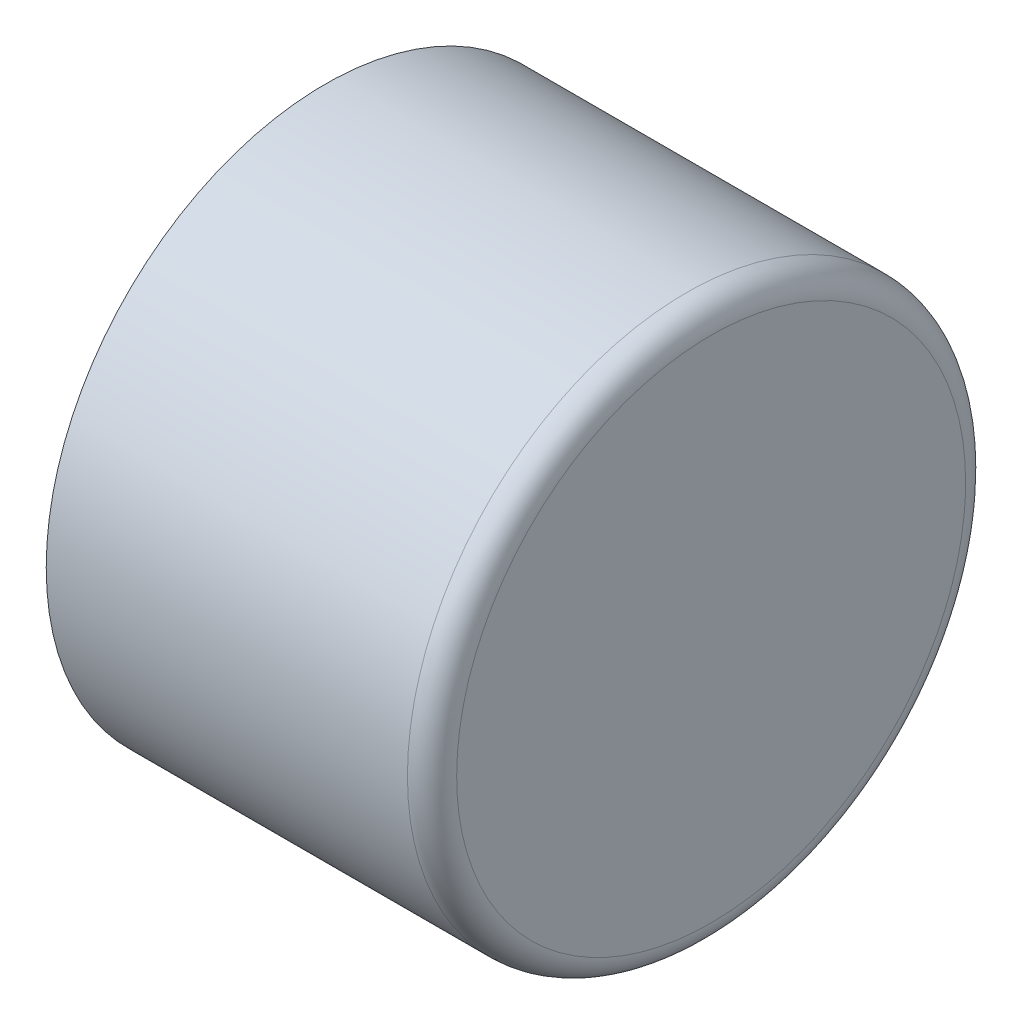
ISO-10303-21;
HEADER;
FILE_DESCRIPTION(('STEP AP214'),'2;1');
FILE_NAME('part.step','',(''),(''),'','','');
FILE_SCHEMA(('AUTOMOTIVE_DESIGN { 1 0 10303 214 1 1 1 1 }'));
ENDSEC;
DATA;
#1=APPLICATION_CONTEXT('core data for automotive mechanical design processes');
#2=APPLICATION_PROTOCOL_DEFINITION('international standard','automotive_design',2000,#1);
#3=PRODUCT_CONTEXT('',#1,'mechanical');
#4=PRODUCT('Part','Part','',(#3));
#5=PRODUCT_RELATED_PRODUCT_CATEGORY('part','',(#4));
#6=PRODUCT_DEFINITION_FORMATION('','',#4);
#7=PRODUCT_DEFINITION_CONTEXT('part definition',#1,'design');
#8=PRODUCT_DEFINITION('design','',#6,#7);
#9=PRODUCT_DEFINITION_SHAPE('','',#8);
#10=(LENGTH_UNIT() NAMED_UNIT(*) SI_UNIT(.MILLI.,.METRE.));
#11=(NAMED_UNIT(*) PLANE_ANGLE_UNIT() SI_UNIT($,.RADIAN.));
#12=(NAMED_UNIT(*) SI_UNIT($,.STERADIAN.) SOLID_ANGLE_UNIT());
#13=UNCERTAINTY_MEASURE_WITH_UNIT(LENGTH_MEASURE(1.E-05),#10,'distance_accuracy_value','');
#14=(GEOMETRIC_REPRESENTATION_CONTEXT(3) GLOBAL_UNCERTAINTY_ASSIGNED_CONTEXT((#13)) GLOBAL_UNIT_ASSIGNED_CONTEXT((#10,
#11,#12)) REPRESENTATION_CONTEXT('',''));
#15=CARTESIAN_POINT('',(0.,0.,0.));
#16=DIRECTION('',(0.,0.,1.));
#17=DIRECTION('',(1.,0.,0.));
#18=AXIS2_PLACEMENT_3D('',#15,#16,#17);
#19=CARTESIAN_POINT('',(3.039999997616,0.,0.75));
#20=DIRECTION('',(1.,0.,0.));
#21=DIRECTION('',(0.,0.,-1.));
#22=AXIS2_PLACEMENT_3D('',#19,#20,#21);
#23=PLANE('',#22);
#24=CARTESIAN_POINT('',(3.039999997616,0.,1.370000007153));
#25=CARTESIAN_POINT('',(3.039999997616,-0.123735626188238,1.370000007153));
#26=CARTESIAN_POINT('',(3.039999997616,-0.2384615412125,1.32230769891049));
#27=CARTESIAN_POINT('',(3.039999997616,-0.309556258854579,1.29275316288885));
#28=CARTESIAN_POINT('',(3.039999997616,-0.37200000429154,1.24600000572246));
#29=CARTESIAN_POINT('',(3.039999997616,-0.481886205752381,1.1637255231243));
#30=CARTESIAN_POINT('',(3.039999997616,-0.547058829840577,1.04176470924853));
#31=CARTESIAN_POINT('',(3.039999997616,-0.619866229472188,0.905516555372864));
#32=CARTESIAN_POINT('',(3.039999997616,-0.62000000715269,0.75));
#33=CARTESIAN_POINT('',(3.039999997616,-0.620132895944621,0.595516777602577));
#34=CARTESIAN_POINT('',(3.039999997616,-0.547058829840577,0.458235290751469));
#35=CARTESIAN_POINT('',(3.039999997616,-0.482557810152685,0.337059662265727));
#36=CARTESIAN_POINT('',(3.039999997616,-0.37200000429154,0.253999994277544));
#37=CARTESIAN_POINT('',(3.039999997616,-0.282352003638266,0.186649406844422));
#38=CARTESIAN_POINT('',(3.039999997616,-0.173600002002691,0.154799993133102));
#39=CARTESIAN_POINT('',(3.039999997616,-0.0889187046914697,0.129999992847));
#40=CARTESIAN_POINT('',(3.039999997616,0.,0.129999992847));
#41=B_SPLINE_CURVE_WITH_KNOTS('',2,(#24,#25,#26,#27,#28,#29,#30,#31,#32,#33,#34,#35,#36,#37,#38,
#39,#40),.UNSPECIFIED.,.F.,.F.,(3,2,2,2,2,2,2,2,3),(0.,0.166666666666667,0.25,0.375,0.5,0.625,
0.75,0.875,1.),.UNSPECIFIED.);
#42=CARTESIAN_POINT('',(3.039999997616,0.,1.370000007153));
#43=VERTEX_POINT('',#42);
#44=CARTESIAN_POINT('',(3.039999997616,0.,0.129999992847001));
#45=VERTEX_POINT('',#44);
#46=EDGE_CURVE('E33',#43,#45,#41,.T.);
#47=ORIENTED_EDGE('',*,*,#46,.T.);
#48=CARTESIAN_POINT('',(3.039999997616,0.,0.75));
#49=DIRECTION('',(1.,0.,0.));
#50=DIRECTION('',(0.,0.,-1.));
#51=AXIS2_PLACEMENT_3D('',#48,#49,#50);
#52=CIRCLE('',#51,0.620000007153);
#53=EDGE_CURVE('E21',#43,#45,#52,.F.);
#54=ORIENTED_EDGE('',*,*,#53,.F.);
#55=EDGE_LOOP('',(#47,#54));
#56=FACE_BOUND('',#55,.T.);
#57=ADVANCED_FACE('F17',(#56),#23,.T.);
#58=CARTESIAN_POINT('',(2.1,0.,0.75));
#59=DIRECTION('',(1.,0.,0.));
#60=DIRECTION('',(0.,0.,-1.));
#61=AXIS2_PLACEMENT_3D('',#58,#59,#60);
#62=PLANE('',#61);
#63=CARTESIAN_POINT('',(2.1,0.,0.75));
#64=DIRECTION('',(1.,0.,0.));
#65=DIRECTION('',(0.,0.,-1.));
#66=AXIS2_PLACEMENT_3D('',#63,#64,#65);
#67=CIRCLE('',#66,0.680000007153);
#68=CARTESIAN_POINT('',(2.1,0.,0.069999992847));
#69=VERTEX_POINT('',#68);
#70=EDGE_CURVE('E26',#69,#69,#67,.T.);
#71=ORIENTED_EDGE('',*,*,#70,.F.);
#72=EDGE_LOOP('',(#71));
#73=FACE_BOUND('',#72,.T.);
#74=ADVANCED_FACE('F49',(#73),#62,.F.);
#75=CARTESIAN_POINT('',(2.979999997616,0.,0.75));
#76=DIRECTION('',(1.,0.,0.));
#77=DIRECTION('',(0.,0.,-1.));
#78=AXIS2_PLACEMENT_3D('',#75,#76,#77);
#79=TOROIDAL_SURFACE('',#78,0.620000007152999,0.0600000000000004);
#80=CARTESIAN_POINT('',(2.979999997616,0.,0.75));
#81=DIRECTION('',(1.,0.,0.));
#82=DIRECTION('',(0.,0.,-1.));
#83=AXIS2_PLACEMENT_3D('',#80,#81,#82);
#84=CIRCLE('',#83,0.680000007153);
#85=CARTESIAN_POINT('',(2.979999997616,0.,0.0699999928470002));
#86=VERTEX_POINT('',#85);
#87=EDGE_CURVE('E11',#86,#86,#84,.F.);
#88=ORIENTED_EDGE('',*,*,#87,.F.);
#89=EDGE_LOOP('',(#88));
#90=FACE_BOUND('',#89,.T.);
#91=ORIENTED_EDGE('',*,*,#53,.T.);
#92=ORIENTED_EDGE('',*,*,#46,.F.);
#93=EDGE_LOOP('',(#91,#92));
#94=FACE_BOUND('',#93,.T.);
#95=ADVANCED_FACE('F19',(#90,#94),#79,.T.);
#96=CARTESIAN_POINT('',(2.1,0.,0.75));
#97=DIRECTION('',(1.,0.,0.));
#98=DIRECTION('',(0.,0.,-1.));
#99=AXIS2_PLACEMENT_3D('',#96,#97,#98);
#100=CYLINDRICAL_SURFACE('',#99,0.680000007153);
#101=ORIENTED_EDGE('',*,*,#70,.T.);
#102=EDGE_LOOP('',(#101));
#103=FACE_BOUND('',#102,.T.);
#104=ORIENTED_EDGE('',*,*,#87,.T.);
#105=EDGE_LOOP('',(#104));
#106=FACE_BOUND('',#105,.T.);
#107=ADVANCED_FACE('F53',(#103,#106),#100,.T.);
#108=CLOSED_SHELL('',(#57,#74,#95,#107));
#109=MANIFOLD_SOLID_BREP('B1',#108);
#110=ADVANCED_BREP_SHAPE_REPRESENTATION('',(#18,#109),#14);
#111=SHAPE_DEFINITION_REPRESENTATION(#9,#110);
ENDSEC;
END-ISO-10303-21;
